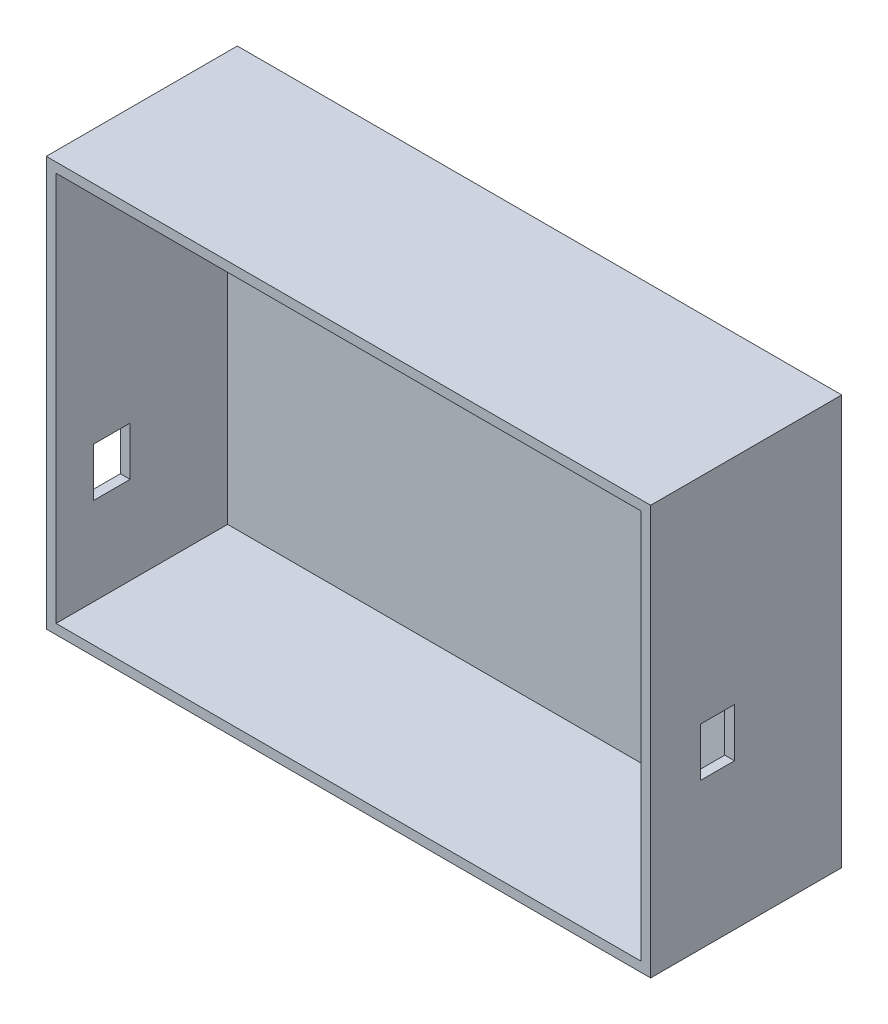
ISO-10303-21;
HEADER;
FILE_DESCRIPTION(('STEP AP214'),'2;1');
FILE_NAME('part.step','',(''),(''),'','','');
FILE_SCHEMA(('AUTOMOTIVE_DESIGN { 1 0 10303 214 1 1 1 1 }'));
ENDSEC;
DATA;
#1=APPLICATION_CONTEXT('core data for automotive mechanical design processes');
#2=APPLICATION_PROTOCOL_DEFINITION('international standard','automotive_design',2000,#1);
#3=PRODUCT_CONTEXT('',#1,'mechanical');
#4=PRODUCT('Part','Part','',(#3));
#5=PRODUCT_RELATED_PRODUCT_CATEGORY('part','',(#4));
#6=PRODUCT_DEFINITION_FORMATION('','',#4);
#7=PRODUCT_DEFINITION_CONTEXT('part definition',#1,'design');
#8=PRODUCT_DEFINITION('design','',#6,#7);
#9=PRODUCT_DEFINITION_SHAPE('','',#8);
#10=(LENGTH_UNIT() NAMED_UNIT(*) SI_UNIT(.MILLI.,.METRE.));
#11=(NAMED_UNIT(*) PLANE_ANGLE_UNIT() SI_UNIT($,.RADIAN.));
#12=(NAMED_UNIT(*) SI_UNIT($,.STERADIAN.) SOLID_ANGLE_UNIT());
#13=UNCERTAINTY_MEASURE_WITH_UNIT(LENGTH_MEASURE(1.E-05),#10,'distance_accuracy_value','');
#14=(GEOMETRIC_REPRESENTATION_CONTEXT(3) GLOBAL_UNCERTAINTY_ASSIGNED_CONTEXT((#13)) GLOBAL_UNIT_ASSIGNED_CONTEXT((#10,
#11,#12)) REPRESENTATION_CONTEXT('',''));
#15=CARTESIAN_POINT('',(0.,0.,0.));
#16=DIRECTION('',(0.,0.,1.));
#17=DIRECTION('',(1.,0.,0.));
#18=AXIS2_PLACEMENT_3D('',#15,#16,#17);
#19=CARTESIAN_POINT('',(78.74,-53.34,49.784));
#20=DIRECTION('',(-1.,0.,0.));
#21=DIRECTION('',(0.,0.,1.));
#22=AXIS2_PLACEMENT_3D('',#19,#20,#21);
#23=PLANE('',#22);
#24=DIRECTION('',(0.,0.,1.));
#25=VECTOR('',#24,1.);
#26=CARTESIAN_POINT('',(78.74,-2.54,36.83));
#27=LINE('',#26,#25);
#28=CARTESIAN_POINT('',(78.74,-2.54000000000001,27.94));
#29=VERTEX_POINT('',#28);
#30=CARTESIAN_POINT('',(78.74,-2.54,36.83));
#31=VERTEX_POINT('',#30);
#32=EDGE_CURVE('E181',#29,#31,#27,.T.);
#33=ORIENTED_EDGE('',*,*,#32,.F.);
#34=DIRECTION('',(0.,1.,0.));
#35=VECTOR('',#34,1.);
#36=CARTESIAN_POINT('',(78.74,-15.24,27.94));
#37=LINE('',#36,#35);
#38=CARTESIAN_POINT('',(78.74,-15.24,27.94));
#39=VERTEX_POINT('',#38);
#40=EDGE_CURVE('E177',#39,#29,#37,.T.);
#41=ORIENTED_EDGE('',*,*,#40,.F.);
#42=DIRECTION('',(0.,0.,-1.));
#43=VECTOR('',#42,1.);
#44=CARTESIAN_POINT('',(78.74,-15.24,36.83));
#45=LINE('',#44,#43);
#46=CARTESIAN_POINT('',(78.74,-15.24,36.83));
#47=VERTEX_POINT('',#46);
#48=EDGE_CURVE('E187',#47,#39,#45,.T.);
#49=ORIENTED_EDGE('',*,*,#48,.F.);
#50=DIRECTION('',(0.,-1.,0.));
#51=VECTOR('',#50,1.);
#52=CARTESIAN_POINT('',(78.74,-15.24,36.83));
#53=LINE('',#52,#51);
#54=EDGE_CURVE('E184',#31,#47,#53,.T.);
#55=ORIENTED_EDGE('',*,*,#54,.F.);
#56=EDGE_LOOP('',(#33,#41,#49,#55));
#57=FACE_BOUND('',#56,.T.);
#58=DIRECTION('',(0.,1.,0.));
#59=VECTOR('',#58,1.);
#60=CARTESIAN_POINT('',(78.74,-53.34,0.));
#61=LINE('',#60,#59);
#62=CARTESIAN_POINT('',(78.74,-53.34,0.));
#63=VERTEX_POINT('',#62);
#64=CARTESIAN_POINT('',(78.74,53.34,0.));
#65=VERTEX_POINT('',#64);
#66=EDGE_CURVE('E225',#63,#65,#61,.T.);
#67=ORIENTED_EDGE('',*,*,#66,.T.);
#68=DIRECTION('',(0.,0.,-1.));
#69=VECTOR('',#68,1.);
#70=CARTESIAN_POINT('',(78.74,53.34,49.784));
#71=LINE('',#70,#69);
#72=CARTESIAN_POINT('',(78.74,53.34,49.784));
#73=VERTEX_POINT('',#72);
#74=EDGE_CURVE('E258',#73,#65,#71,.T.);
#75=ORIENTED_EDGE('',*,*,#74,.F.);
#76=DIRECTION('',(0.,1.,0.));
#77=VECTOR('',#76,1.);
#78=CARTESIAN_POINT('',(78.74,-53.34,49.784));
#79=LINE('',#78,#77);
#80=CARTESIAN_POINT('',(78.74,-53.34,49.784));
#81=VERTEX_POINT('',#80);
#82=EDGE_CURVE('E232',#81,#73,#79,.T.);
#83=ORIENTED_EDGE('',*,*,#82,.F.);
#84=DIRECTION('',(0.,0.,-1.));
#85=VECTOR('',#84,1.);
#86=CARTESIAN_POINT('',(78.74,-53.34,49.784));
#87=LINE('',#86,#85);
#88=EDGE_CURVE('E242',#81,#63,#87,.T.);
#89=ORIENTED_EDGE('',*,*,#88,.T.);
#90=EDGE_LOOP('',(#67,#75,#83,#89));
#91=FACE_BOUND('',#90,.T.);
#92=ADVANCED_FACE('F39',(#57,#91),#23,.F.);
#93=CARTESIAN_POINT('',(-78.74,53.34,49.784));
#94=DIRECTION('',(0.,-1.,0.));
#95=DIRECTION('',(0.,0.,-1.));
#96=AXIS2_PLACEMENT_3D('',#93,#94,#95);
#97=PLANE('',#96);
#98=DIRECTION('',(-1.,0.,0.));
#99=VECTOR('',#98,1.);
#100=CARTESIAN_POINT('',(-78.74,53.34,0.));
#101=LINE('',#100,#99);
#102=CARTESIAN_POINT('',(-78.74,53.34,0.));
#103=VERTEX_POINT('',#102);
#104=EDGE_CURVE('E245',#65,#103,#101,.T.);
#105=ORIENTED_EDGE('',*,*,#104,.T.);
#106=DIRECTION('',(0.,0.,-1.));
#107=VECTOR('',#106,1.);
#108=CARTESIAN_POINT('',(-78.74,53.34,49.784));
#109=LINE('',#108,#107);
#110=CARTESIAN_POINT('',(-78.74,53.34,49.784));
#111=VERTEX_POINT('',#110);
#112=EDGE_CURVE('E255',#111,#103,#109,.T.);
#113=ORIENTED_EDGE('',*,*,#112,.F.);
#114=DIRECTION('',(-1.,0.,0.));
#115=VECTOR('',#114,1.);
#116=CARTESIAN_POINT('',(-78.74,53.34,49.784));
#117=LINE('',#116,#115);
#118=EDGE_CURVE('E235',#73,#111,#117,.T.);
#119=ORIENTED_EDGE('',*,*,#118,.F.);
#120=ORIENTED_EDGE('',*,*,#74,.T.);
#121=EDGE_LOOP('',(#105,#113,#119,#120));
#122=FACE_BOUND('',#121,.T.);
#123=ADVANCED_FACE('F297',(#122),#97,.F.);
#124=CARTESIAN_POINT('',(-78.74,-53.34,49.784));
#125=DIRECTION('',(1.,0.,0.));
#126=DIRECTION('',(0.,0.,-1.));
#127=AXIS2_PLACEMENT_3D('',#124,#125,#126);
#128=PLANE('',#127);
#129=DIRECTION('',(0.,0.,-1.));
#130=VECTOR('',#129,1.);
#131=CARTESIAN_POINT('',(-78.74,-15.24,30.48));
#132=LINE('',#131,#130);
#133=CARTESIAN_POINT('',(-78.74,-15.24,40.005));
#134=VERTEX_POINT('',#133);
#135=CARTESIAN_POINT('',(-78.74,-15.24,30.48));
#136=VERTEX_POINT('',#135);
#137=EDGE_CURVE('E163',#134,#136,#132,.T.);
#138=ORIENTED_EDGE('',*,*,#137,.F.);
#139=DIRECTION('',(0.,1.,0.));
#140=VECTOR('',#139,1.);
#141=CARTESIAN_POINT('',(-78.74,-15.24,40.005));
#142=LINE('',#141,#140);
#143=CARTESIAN_POINT('',(-78.74,-27.94,40.005));
#144=VERTEX_POINT('',#143);
#145=EDGE_CURVE('E53',#144,#134,#142,.T.);
#146=ORIENTED_EDGE('',*,*,#145,.F.);
#147=DIRECTION('',(0.,0.,1.));
#148=VECTOR('',#147,1.);
#149=CARTESIAN_POINT('',(-78.74,-27.94,30.48));
#150=LINE('',#149,#148);
#151=CARTESIAN_POINT('',(-78.74,-27.94,30.48));
#152=VERTEX_POINT('',#151);
#153=EDGE_CURVE('E170',#152,#144,#150,.T.);
#154=ORIENTED_EDGE('',*,*,#153,.F.);
#155=DIRECTION('',(0.,-1.,0.));
#156=VECTOR('',#155,1.);
#157=CARTESIAN_POINT('',(-78.74,-15.24,30.48));
#158=LINE('',#157,#156);
#159=EDGE_CURVE('E154',#136,#152,#158,.T.);
#160=ORIENTED_EDGE('',*,*,#159,.F.);
#161=EDGE_LOOP('',(#138,#146,#154,#160));
#162=FACE_BOUND('',#161,.T.);
#163=DIRECTION('',(0.,-1.,0.));
#164=VECTOR('',#163,1.);
#165=CARTESIAN_POINT('',(-78.74,-53.34,0.));
#166=LINE('',#165,#164);
#167=CARTESIAN_POINT('',(-78.74,-53.34,0.));
#168=VERTEX_POINT('',#167);
#169=EDGE_CURVE('E247',#103,#168,#166,.T.);
#170=ORIENTED_EDGE('',*,*,#169,.T.);
#171=DIRECTION('',(0.,0.,-1.));
#172=VECTOR('',#171,1.);
#173=CARTESIAN_POINT('',(-78.74,-53.34,49.784));
#174=LINE('',#173,#172);
#175=CARTESIAN_POINT('',(-78.74,-53.34,49.784));
#176=VERTEX_POINT('',#175);
#177=EDGE_CURVE('E252',#176,#168,#174,.T.);
#178=ORIENTED_EDGE('',*,*,#177,.F.);
#179=DIRECTION('',(0.,-1.,0.));
#180=VECTOR('',#179,1.);
#181=CARTESIAN_POINT('',(-78.74,-53.34,49.784));
#182=LINE('',#181,#180);
#183=EDGE_CURVE('E238',#111,#176,#182,.T.);
#184=ORIENTED_EDGE('',*,*,#183,.F.);
#185=ORIENTED_EDGE('',*,*,#112,.T.);
#186=EDGE_LOOP('',(#170,#178,#184,#185));
#187=FACE_BOUND('',#186,.T.);
#188=ADVANCED_FACE('F167',(#162,#187),#128,.F.);
#189=CARTESIAN_POINT('',(-78.74,-53.34,49.784));
#190=DIRECTION('',(0.,1.,0.));
#191=DIRECTION('',(0.,0.,1.));
#192=AXIS2_PLACEMENT_3D('',#189,#190,#191);
#193=PLANE('',#192);
#194=DIRECTION('',(1.,0.,0.));
#195=VECTOR('',#194,1.);
#196=CARTESIAN_POINT('',(-78.74,-53.34,0.));
#197=LINE('',#196,#195);
#198=EDGE_CURVE('E236',#168,#63,#197,.T.);
#199=ORIENTED_EDGE('',*,*,#198,.T.);
#200=ORIENTED_EDGE('',*,*,#88,.F.);
#201=DIRECTION('',(1.,0.,0.));
#202=VECTOR('',#201,1.);
#203=CARTESIAN_POINT('',(-78.74,-53.34,49.784));
#204=LINE('',#203,#202);
#205=EDGE_CURVE('E240',#176,#81,#204,.T.);
#206=ORIENTED_EDGE('',*,*,#205,.F.);
#207=ORIENTED_EDGE('',*,*,#177,.T.);
#208=EDGE_LOOP('',(#199,#200,#206,#207));
#209=FACE_BOUND('',#208,.T.);
#210=ADVANCED_FACE('F322',(#209),#193,.F.);
#211=CARTESIAN_POINT('',(0.,0.,49.784));
#212=DIRECTION('',(0.,0.,-1.));
#213=DIRECTION('',(-1.,0.,0.));
#214=AXIS2_PLACEMENT_3D('',#211,#212,#213);
#215=PLANE('',#214);
#216=DIRECTION('',(-1.,0.,0.));
#217=VECTOR('',#216,1.);
#218=CARTESIAN_POINT('',(-76.1999999999999,50.8,49.784));
#219=LINE('',#218,#217);
#220=CARTESIAN_POINT('',(76.2000000000001,50.8,49.784));
#221=VERTEX_POINT('',#220);
#222=CARTESIAN_POINT('',(-76.1999999999999,50.8,49.784));
#223=VERTEX_POINT('',#222);
#224=EDGE_CURVE('E215',#221,#223,#219,.T.);
#225=ORIENTED_EDGE('',*,*,#224,.F.);
#226=DIRECTION('',(0.,1.,0.));
#227=VECTOR('',#226,1.);
#228=CARTESIAN_POINT('',(76.2000000000001,-50.8,49.784));
#229=LINE('',#228,#227);
#230=CARTESIAN_POINT('',(76.2000000000001,-50.8,49.784));
#231=VERTEX_POINT('',#230);
#232=EDGE_CURVE('E193',#231,#221,#229,.T.);
#233=ORIENTED_EDGE('',*,*,#232,.F.);
#234=DIRECTION('',(1.,0.,0.));
#235=VECTOR('',#234,1.);
#236=CARTESIAN_POINT('',(-76.1999999999999,-50.8,49.784));
#237=LINE('',#236,#235);
#238=CARTESIAN_POINT('',(-76.1999999999999,-50.8,49.784));
#239=VERTEX_POINT('',#238);
#240=EDGE_CURVE('E204',#239,#231,#237,.T.);
#241=ORIENTED_EDGE('',*,*,#240,.F.);
#242=DIRECTION('',(0.,-1.,0.));
#243=VECTOR('',#242,1.);
#244=CARTESIAN_POINT('',(-76.1999999999999,-50.8,49.784));
#245=LINE('',#244,#243);
#246=EDGE_CURVE('E218',#223,#239,#245,.T.);
#247=ORIENTED_EDGE('',*,*,#246,.F.);
#248=EDGE_LOOP('',(#225,#233,#241,#247));
#249=FACE_BOUND('',#248,.T.);
#250=ORIENTED_EDGE('',*,*,#82,.T.);
#251=ORIENTED_EDGE('',*,*,#118,.T.);
#252=ORIENTED_EDGE('',*,*,#183,.T.);
#253=ORIENTED_EDGE('',*,*,#205,.T.);
#254=EDGE_LOOP('',(#250,#251,#252,#253));
#255=FACE_BOUND('',#254,.T.);
#256=ADVANCED_FACE('F318',(#249,#255),#215,.F.);
#257=CARTESIAN_POINT('',(0.,0.,0.));
#258=DIRECTION('',(0.,0.,-1.));
#259=DIRECTION('',(-1.,0.,0.));
#260=AXIS2_PLACEMENT_3D('',#257,#258,#259);
#261=PLANE('',#260);
#262=ORIENTED_EDGE('',*,*,#66,.F.);
#263=ORIENTED_EDGE('',*,*,#198,.F.);
#264=ORIENTED_EDGE('',*,*,#169,.F.);
#265=ORIENTED_EDGE('',*,*,#104,.F.);
#266=EDGE_LOOP('',(#262,#263,#264,#265));
#267=FACE_BOUND('',#266,.T.);
#268=ADVANCED_FACE('F313',(#267),#261,.T.);
#269=CARTESIAN_POINT('',(76.2000000000001,-50.8,5.07999999999999));
#270=DIRECTION('',(1.,0.,0.));
#271=DIRECTION('',(0.,0.,-1.));
#272=AXIS2_PLACEMENT_3D('',#269,#270,#271);
#273=PLANE('',#272);
#274=DIRECTION('',(0.,0.,-1.));
#275=VECTOR('',#274,1.);
#276=CARTESIAN_POINT('',(76.2000000000001,-15.24,5.07999999999999));
#277=LINE('',#276,#275);
#278=CARTESIAN_POINT('',(76.2000000000001,-15.24,36.83));
#279=VERTEX_POINT('',#278);
#280=CARTESIAN_POINT('',(76.2000000000001,-15.24,27.94));
#281=VERTEX_POINT('',#280);
#282=EDGE_CURVE('E267',#279,#281,#277,.T.);
#283=ORIENTED_EDGE('',*,*,#282,.T.);
#284=DIRECTION('',(0.,1.,0.));
#285=VECTOR('',#284,1.);
#286=CARTESIAN_POINT('',(76.2000000000001,-50.8,27.94));
#287=LINE('',#286,#285);
#288=CARTESIAN_POINT('',(76.2000000000001,-2.54,27.94));
#289=VERTEX_POINT('',#288);
#290=EDGE_CURVE('E270',#281,#289,#287,.T.);
#291=ORIENTED_EDGE('',*,*,#290,.T.);
#292=DIRECTION('',(0.,0.,1.));
#293=VECTOR('',#292,1.);
#294=CARTESIAN_POINT('',(76.2000000000001,-2.54,5.07999999999999));
#295=LINE('',#294,#293);
#296=CARTESIAN_POINT('',(76.2000000000001,-2.54,36.83));
#297=VERTEX_POINT('',#296);
#298=EDGE_CURVE('E261',#289,#297,#295,.T.);
#299=ORIENTED_EDGE('',*,*,#298,.T.);
#300=DIRECTION('',(0.,-1.,0.));
#301=VECTOR('',#300,1.);
#302=CARTESIAN_POINT('',(76.2000000000001,-50.8,36.83));
#303=LINE('',#302,#301);
#304=EDGE_CURVE('E264',#297,#279,#303,.T.);
#305=ORIENTED_EDGE('',*,*,#304,.T.);
#306=EDGE_LOOP('',(#283,#291,#299,#305));
#307=FACE_BOUND('',#306,.T.);
#308=ORIENTED_EDGE('',*,*,#232,.T.);
#309=DIRECTION('',(0.,0.,1.));
#310=VECTOR('',#309,1.);
#311=CARTESIAN_POINT('',(76.2000000000001,50.8,5.07999999999999));
#312=LINE('',#311,#310);
#313=CARTESIAN_POINT('',(76.2000000000001,50.8,5.07999999999999));
#314=VERTEX_POINT('',#313);
#315=EDGE_CURVE('E213',#314,#221,#312,.T.);
#316=ORIENTED_EDGE('',*,*,#315,.F.);
#317=DIRECTION('',(0.,1.,0.));
#318=VECTOR('',#317,1.);
#319=CARTESIAN_POINT('',(76.2000000000001,-50.8,5.07999999999999));
#320=LINE('',#319,#318);
#321=CARTESIAN_POINT('',(76.2000000000001,-50.8,5.07999999999999));
#322=VERTEX_POINT('',#321);
#323=EDGE_CURVE('E200',#322,#314,#320,.T.);
#324=ORIENTED_EDGE('',*,*,#323,.F.);
#325=DIRECTION('',(0.,0.,1.));
#326=VECTOR('',#325,1.);
#327=CARTESIAN_POINT('',(76.2000000000001,-50.8,5.07999999999999));
#328=LINE('',#327,#326);
#329=EDGE_CURVE('E223',#322,#231,#328,.T.);
#330=ORIENTED_EDGE('',*,*,#329,.T.);
#331=EDGE_LOOP('',(#308,#316,#324,#330));
#332=FACE_BOUND('',#331,.T.);
#333=ADVANCED_FACE('F332',(#307,#332),#273,.F.);
#334=CARTESIAN_POINT('',(-76.1999999999999,-50.8,5.07999999999999));
#335=DIRECTION('',(0.,-1.,0.));
#336=DIRECTION('',(0.,0.,-1.));
#337=AXIS2_PLACEMENT_3D('',#334,#335,#336);
#338=PLANE('',#337);
#339=ORIENTED_EDGE('',*,*,#240,.T.);
#340=ORIENTED_EDGE('',*,*,#329,.F.);
#341=DIRECTION('',(1.,0.,0.));
#342=VECTOR('',#341,1.);
#343=CARTESIAN_POINT('',(-76.1999999999999,-50.8,5.07999999999999));
#344=LINE('',#343,#342);
#345=CARTESIAN_POINT('',(-76.1999999999999,-50.8,5.07999999999999));
#346=VERTEX_POINT('',#345);
#347=EDGE_CURVE('E210',#346,#322,#344,.T.);
#348=ORIENTED_EDGE('',*,*,#347,.F.);
#349=DIRECTION('',(0.,0.,1.));
#350=VECTOR('',#349,1.);
#351=CARTESIAN_POINT('',(-76.1999999999999,-50.8,5.07999999999999));
#352=LINE('',#351,#350);
#353=EDGE_CURVE('E226',#346,#239,#352,.T.);
#354=ORIENTED_EDGE('',*,*,#353,.T.);
#355=EDGE_LOOP('',(#339,#340,#348,#354));
#356=FACE_BOUND('',#355,.T.);
#357=ADVANCED_FACE('F338',(#356),#338,.F.);
#358=CARTESIAN_POINT('',(-76.1999999999999,-50.8,5.07999999999999));
#359=DIRECTION('',(-1.,0.,0.));
#360=DIRECTION('',(0.,0.,1.));
#361=AXIS2_PLACEMENT_3D('',#358,#359,#360);
#362=PLANE('',#361);
#363=DIRECTION('',(0.,0.,1.));
#364=VECTOR('',#363,1.);
#365=CARTESIAN_POINT('',(-76.1999999999999,-27.94,5.07999999999999));
#366=LINE('',#365,#364);
#367=CARTESIAN_POINT('',(-76.1999999999999,-27.94,30.48));
#368=VERTEX_POINT('',#367);
#369=CARTESIAN_POINT('',(-76.1999999999999,-27.94,40.005));
#370=VERTEX_POINT('',#369);
#371=EDGE_CURVE('E46',#368,#370,#366,.T.);
#372=ORIENTED_EDGE('',*,*,#371,.T.);
#373=DIRECTION('',(0.,1.,0.));
#374=VECTOR('',#373,1.);
#375=CARTESIAN_POINT('',(-76.1999999999999,-50.8,40.005));
#376=LINE('',#375,#374);
#377=CARTESIAN_POINT('',(-76.1999999999999,-15.24,40.005));
#378=VERTEX_POINT('',#377);
#379=EDGE_CURVE('E11',#370,#378,#376,.T.);
#380=ORIENTED_EDGE('',*,*,#379,.T.);
#381=DIRECTION('',(0.,0.,-1.));
#382=VECTOR('',#381,1.);
#383=CARTESIAN_POINT('',(-76.1999999999999,-15.24,5.07999999999999));
#384=LINE('',#383,#382);
#385=CARTESIAN_POINT('',(-76.1999999999999,-15.24,30.48));
#386=VERTEX_POINT('',#385);
#387=EDGE_CURVE('E273',#378,#386,#384,.T.);
#388=ORIENTED_EDGE('',*,*,#387,.T.);
#389=DIRECTION('',(0.,-1.,0.));
#390=VECTOR('',#389,1.);
#391=CARTESIAN_POINT('',(-76.1999999999999,-50.8,30.48));
#392=LINE('',#391,#390);
#393=EDGE_CURVE('E157',#386,#368,#392,.T.);
#394=ORIENTED_EDGE('',*,*,#393,.T.);
#395=EDGE_LOOP('',(#372,#380,#388,#394));
#396=FACE_BOUND('',#395,.T.);
#397=ORIENTED_EDGE('',*,*,#246,.T.);
#398=ORIENTED_EDGE('',*,*,#353,.F.);
#399=DIRECTION('',(0.,-1.,0.));
#400=VECTOR('',#399,1.);
#401=CARTESIAN_POINT('',(-76.1999999999999,-50.8,5.07999999999999));
#402=LINE('',#401,#400);
#403=CARTESIAN_POINT('',(-76.1999999999999,50.8,5.07999999999999));
#404=VERTEX_POINT('',#403);
#405=EDGE_CURVE('E207',#404,#346,#402,.T.);
#406=ORIENTED_EDGE('',*,*,#405,.F.);
#407=DIRECTION('',(0.,0.,1.));
#408=VECTOR('',#407,1.);
#409=CARTESIAN_POINT('',(-76.1999999999999,50.8,5.07999999999999));
#410=LINE('',#409,#408);
#411=EDGE_CURVE('E228',#404,#223,#410,.T.);
#412=ORIENTED_EDGE('',*,*,#411,.T.);
#413=EDGE_LOOP('',(#397,#398,#406,#412));
#414=FACE_BOUND('',#413,.T.);
#415=ADVANCED_FACE('F277',(#396,#414),#362,.F.);
#416=CARTESIAN_POINT('',(-76.1999999999999,50.8,5.07999999999999));
#417=DIRECTION('',(0.,1.,0.));
#418=DIRECTION('',(0.,0.,1.));
#419=AXIS2_PLACEMENT_3D('',#416,#417,#418);
#420=PLANE('',#419);
#421=ORIENTED_EDGE('',*,*,#224,.T.);
#422=ORIENTED_EDGE('',*,*,#411,.F.);
#423=DIRECTION('',(-1.,0.,0.));
#424=VECTOR('',#423,1.);
#425=CARTESIAN_POINT('',(-76.1999999999999,50.8,5.07999999999999));
#426=LINE('',#425,#424);
#427=EDGE_CURVE('E203',#314,#404,#426,.T.);
#428=ORIENTED_EDGE('',*,*,#427,.F.);
#429=ORIENTED_EDGE('',*,*,#315,.T.);
#430=EDGE_LOOP('',(#421,#422,#428,#429));
#431=FACE_BOUND('',#430,.T.);
#432=ADVANCED_FACE('F340',(#431),#420,.F.);
#433=CARTESIAN_POINT('',(0.,0.,5.07999999999999));
#434=DIRECTION('',(0.,0.,-1.));
#435=DIRECTION('',(-1.,0.,0.));
#436=AXIS2_PLACEMENT_3D('',#433,#434,#435);
#437=PLANE('',#436);
#438=ORIENTED_EDGE('',*,*,#323,.T.);
#439=ORIENTED_EDGE('',*,*,#427,.T.);
#440=ORIENTED_EDGE('',*,*,#405,.T.);
#441=ORIENTED_EDGE('',*,*,#347,.T.);
#442=EDGE_LOOP('',(#438,#439,#440,#441));
#443=FACE_BOUND('',#442,.T.);
#444=ADVANCED_FACE('F343',(#443),#437,.F.);
#445=CARTESIAN_POINT('',(35.56,-15.24,27.94));
#446=DIRECTION('',(0.,0.,-1.));
#447=DIRECTION('',(-1.,0.,0.));
#448=AXIS2_PLACEMENT_3D('',#445,#446,#447);
#449=PLANE('',#448);
#450=DIRECTION('',(1.,0.,0.));
#451=VECTOR('',#450,1.);
#452=CARTESIAN_POINT('',(35.56,-15.24,27.94));
#453=LINE('',#452,#451);
#454=EDGE_CURVE('E191',#281,#39,#453,.T.);
#455=ORIENTED_EDGE('',*,*,#454,.T.);
#456=ORIENTED_EDGE('',*,*,#40,.T.);
#457=DIRECTION('',(1.,0.,0.));
#458=VECTOR('',#457,1.);
#459=CARTESIAN_POINT('',(35.56,-2.54,27.94));
#460=LINE('',#459,#458);
#461=EDGE_CURVE('E190',#289,#29,#460,.T.);
#462=ORIENTED_EDGE('',*,*,#461,.F.);
#463=ORIENTED_EDGE('',*,*,#290,.F.);
#464=EDGE_LOOP('',(#455,#456,#462,#463));
#465=FACE_BOUND('',#464,.T.);
#466=ADVANCED_FACE('F352',(#465),#449,.F.);
#467=CARTESIAN_POINT('',(35.56,-15.24,36.83));
#468=DIRECTION('',(0.,-1.,0.));
#469=DIRECTION('',(0.,0.,-1.));
#470=AXIS2_PLACEMENT_3D('',#467,#468,#469);
#471=PLANE('',#470);
#472=DIRECTION('',(1.,0.,0.));
#473=VECTOR('',#472,1.);
#474=CARTESIAN_POINT('',(35.56,-15.24,36.83));
#475=LINE('',#474,#473);
#476=EDGE_CURVE('E194',#279,#47,#475,.T.);
#477=ORIENTED_EDGE('',*,*,#476,.T.);
#478=ORIENTED_EDGE('',*,*,#48,.T.);
#479=ORIENTED_EDGE('',*,*,#454,.F.);
#480=ORIENTED_EDGE('',*,*,#282,.F.);
#481=EDGE_LOOP('',(#477,#478,#479,#480));
#482=FACE_BOUND('',#481,.T.);
#483=ADVANCED_FACE('F355',(#482),#471,.F.);
#484=CARTESIAN_POINT('',(35.56,-15.24,36.83));
#485=DIRECTION('',(0.,0.,1.));
#486=DIRECTION('',(1.,0.,0.));
#487=AXIS2_PLACEMENT_3D('',#484,#485,#486);
#488=PLANE('',#487);
#489=DIRECTION('',(1.,0.,0.));
#490=VECTOR('',#489,1.);
#491=CARTESIAN_POINT('',(35.56,-2.54,36.83));
#492=LINE('',#491,#490);
#493=EDGE_CURVE('E196',#297,#31,#492,.T.);
#494=ORIENTED_EDGE('',*,*,#493,.T.);
#495=ORIENTED_EDGE('',*,*,#54,.T.);
#496=ORIENTED_EDGE('',*,*,#476,.F.);
#497=ORIENTED_EDGE('',*,*,#304,.F.);
#498=EDGE_LOOP('',(#494,#495,#496,#497));
#499=FACE_BOUND('',#498,.T.);
#500=ADVANCED_FACE('F291',(#499),#488,.F.);
#501=CARTESIAN_POINT('',(35.56,-2.54,36.83));
#502=DIRECTION('',(0.,1.,0.));
#503=DIRECTION('',(0.,0.,1.));
#504=AXIS2_PLACEMENT_3D('',#501,#502,#503);
#505=PLANE('',#504);
#506=ORIENTED_EDGE('',*,*,#461,.T.);
#507=ORIENTED_EDGE('',*,*,#32,.T.);
#508=ORIENTED_EDGE('',*,*,#493,.F.);
#509=ORIENTED_EDGE('',*,*,#298,.F.);
#510=EDGE_LOOP('',(#506,#507,#508,#509));
#511=FACE_BOUND('',#510,.T.);
#512=ADVANCED_FACE('F284',(#511),#505,.F.);
#513=CARTESIAN_POINT('',(-35.56,-15.24,40.005));
#514=DIRECTION('',(0.,0.,1.));
#515=DIRECTION('',(1.,0.,0.));
#516=AXIS2_PLACEMENT_3D('',#513,#514,#515);
#517=PLANE('',#516);
#518=DIRECTION('',(-1.,0.,0.));
#519=VECTOR('',#518,1.);
#520=CARTESIAN_POINT('',(-35.56,-27.94,40.005));
#521=LINE('',#520,#519);
#522=EDGE_CURVE('E175',#370,#144,#521,.T.);
#523=ORIENTED_EDGE('',*,*,#522,.T.);
#524=ORIENTED_EDGE('',*,*,#145,.T.);
#525=DIRECTION('',(-1.,0.,0.));
#526=VECTOR('',#525,1.);
#527=CARTESIAN_POINT('',(-35.56,-15.24,40.005));
#528=LINE('',#527,#526);
#529=EDGE_CURVE('E160',#378,#134,#528,.T.);
#530=ORIENTED_EDGE('',*,*,#529,.F.);
#531=ORIENTED_EDGE('',*,*,#379,.F.);
#532=EDGE_LOOP('',(#523,#524,#530,#531));
#533=FACE_BOUND('',#532,.T.);
#534=ADVANCED_FACE('F282',(#533),#517,.F.);
#535=CARTESIAN_POINT('',(-35.56,-27.94,30.48));
#536=DIRECTION('',(0.,-1.,0.));
#537=DIRECTION('',(0.,0.,-1.));
#538=AXIS2_PLACEMENT_3D('',#535,#536,#537);
#539=PLANE('',#538);
#540=DIRECTION('',(-1.,0.,0.));
#541=VECTOR('',#540,1.);
#542=CARTESIAN_POINT('',(-35.56,-27.94,30.48));
#543=LINE('',#542,#541);
#544=EDGE_CURVE('E159',#368,#152,#543,.T.);
#545=ORIENTED_EDGE('',*,*,#544,.T.);
#546=ORIENTED_EDGE('',*,*,#153,.T.);
#547=ORIENTED_EDGE('',*,*,#522,.F.);
#548=ORIENTED_EDGE('',*,*,#371,.F.);
#549=EDGE_LOOP('',(#545,#546,#547,#548));
#550=FACE_BOUND('',#549,.T.);
#551=ADVANCED_FACE('F281',(#550),#539,.F.);
#552=CARTESIAN_POINT('',(-35.56,-15.24,30.48));
#553=DIRECTION('',(0.,0.,-1.));
#554=DIRECTION('',(-1.,0.,0.));
#555=AXIS2_PLACEMENT_3D('',#552,#553,#554);
#556=PLANE('',#555);
#557=DIRECTION('',(-1.,0.,0.));
#558=VECTOR('',#557,1.);
#559=CARTESIAN_POINT('',(-35.56,-15.24,30.48));
#560=LINE('',#559,#558);
#561=EDGE_CURVE('E61',#386,#136,#560,.T.);
#562=ORIENTED_EDGE('',*,*,#561,.T.);
#563=ORIENTED_EDGE('',*,*,#159,.T.);
#564=ORIENTED_EDGE('',*,*,#544,.F.);
#565=ORIENTED_EDGE('',*,*,#393,.F.);
#566=EDGE_LOOP('',(#562,#563,#564,#565));
#567=FACE_BOUND('',#566,.T.);
#568=ADVANCED_FACE('F151',(#567),#556,.F.);
#569=CARTESIAN_POINT('',(-35.56,-15.24,30.48));
#570=DIRECTION('',(0.,1.,0.));
#571=DIRECTION('',(0.,0.,1.));
#572=AXIS2_PLACEMENT_3D('',#569,#570,#571);
#573=PLANE('',#572);
#574=ORIENTED_EDGE('',*,*,#529,.T.);
#575=ORIENTED_EDGE('',*,*,#137,.T.);
#576=ORIENTED_EDGE('',*,*,#561,.F.);
#577=ORIENTED_EDGE('',*,*,#387,.F.);
#578=EDGE_LOOP('',(#574,#575,#576,#577));
#579=FACE_BOUND('',#578,.T.);
#580=ADVANCED_FACE('F164',(#579),#573,.F.);
#581=CLOSED_SHELL('',(#92,#123,#188,#210,#256,#268,#333,#357,#415,#432,#444,#466,#483,#500,#512,
#534,#551,#568,#580));
#582=MANIFOLD_SOLID_BREP('B2',#581);
#583=ADVANCED_BREP_SHAPE_REPRESENTATION('',(#18,#582),#14);
#584=SHAPE_DEFINITION_REPRESENTATION(#9,#583);
ENDSEC;
END-ISO-10303-21;
